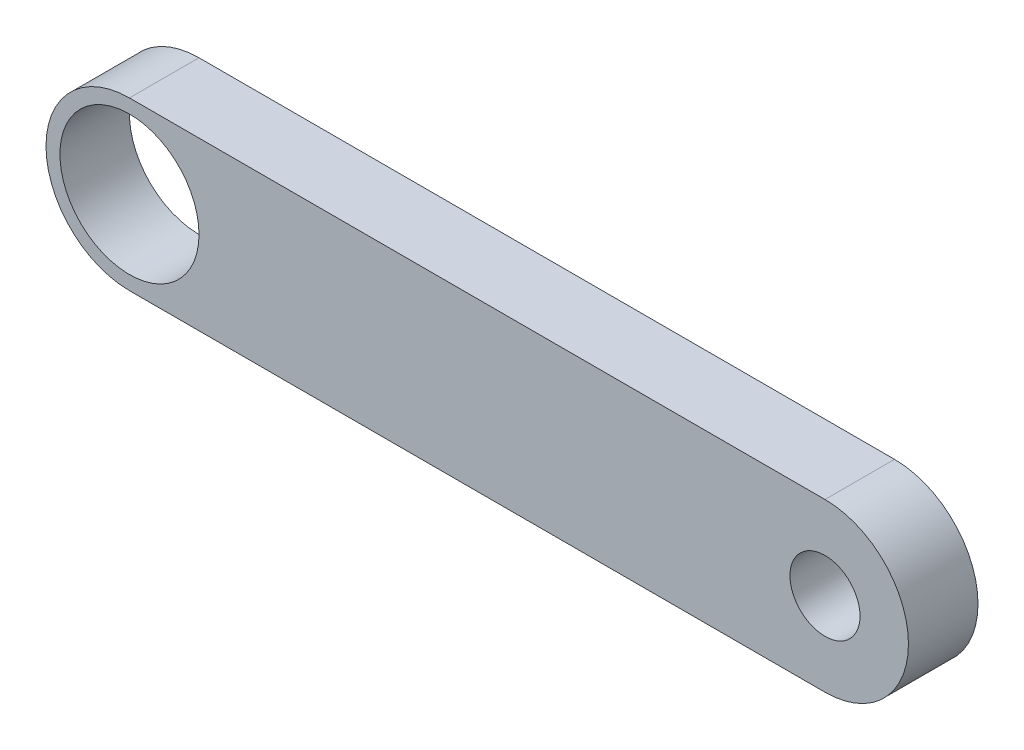
ISO-10303-21;
HEADER;
FILE_DESCRIPTION(('STEP AP214'),'2;1');
FILE_NAME('part.step','',(''),(''),'','','');
FILE_SCHEMA(('AUTOMOTIVE_DESIGN { 1 0 10303 214 1 1 1 1 }'));
ENDSEC;
DATA;
#1=APPLICATION_CONTEXT('core data for automotive mechanical design processes');
#2=APPLICATION_PROTOCOL_DEFINITION('international standard','automotive_design',2000,#1);
#3=PRODUCT_CONTEXT('',#1,'mechanical');
#4=PRODUCT('Part','Part','',(#3));
#5=PRODUCT_RELATED_PRODUCT_CATEGORY('part','',(#4));
#6=PRODUCT_DEFINITION_FORMATION('','',#4);
#7=PRODUCT_DEFINITION_CONTEXT('part definition',#1,'design');
#8=PRODUCT_DEFINITION('design','',#6,#7);
#9=PRODUCT_DEFINITION_SHAPE('','',#8);
#10=(LENGTH_UNIT() NAMED_UNIT(*) SI_UNIT(.MILLI.,.METRE.));
#11=(NAMED_UNIT(*) PLANE_ANGLE_UNIT() SI_UNIT($,.RADIAN.));
#12=(NAMED_UNIT(*) SI_UNIT($,.STERADIAN.) SOLID_ANGLE_UNIT());
#13=UNCERTAINTY_MEASURE_WITH_UNIT(LENGTH_MEASURE(1.E-05),#10,'distance_accuracy_value','');
#14=(GEOMETRIC_REPRESENTATION_CONTEXT(3) GLOBAL_UNCERTAINTY_ASSIGNED_CONTEXT((#13)) GLOBAL_UNIT_ASSIGNED_CONTEXT((#10,
#11,#12)) REPRESENTATION_CONTEXT('',''));
#15=CARTESIAN_POINT('',(0.,0.,0.));
#16=DIRECTION('',(0.,0.,1.));
#17=DIRECTION('',(1.,0.,0.));
#18=AXIS2_PLACEMENT_3D('',#15,#16,#17);
#19=CARTESIAN_POINT('',(0.,0.,5.));
#20=DIRECTION('',(0.,0.,1.));
#21=DIRECTION('',(1.,0.,0.));
#22=AXIS2_PLACEMENT_3D('',#19,#20,#21);
#23=PLANE('',#22);
#24=CARTESIAN_POINT('',(0.,0.,5.));
#25=DIRECTION('',(0.,0.,1.));
#26=DIRECTION('',(1.,0.,0.));
#27=AXIS2_PLACEMENT_3D('',#24,#25,#26);
#28=CIRCLE('',#27,5.);
#29=CARTESIAN_POINT('',(5.,0.,5.));
#30=VERTEX_POINT('',#29);
#31=EDGE_CURVE('E126',#30,#30,#28,.T.);
#32=ORIENTED_EDGE('',*,*,#31,.F.);
#33=EDGE_LOOP('',(#32));
#34=FACE_BOUND('',#33,.T.);
#35=CARTESIAN_POINT('',(0.,0.,5.));
#36=DIRECTION('',(0.,0.,1.));
#37=DIRECTION('',(1.,0.,0.));
#38=AXIS2_PLACEMENT_3D('',#35,#36,#37);
#39=CIRCLE('',#38,6.);
#40=CARTESIAN_POINT('',(0.,6.,5.));
#41=VERTEX_POINT('',#40);
#42=CARTESIAN_POINT('',(0.,-6.,5.));
#43=VERTEX_POINT('',#42);
#44=EDGE_CURVE('E93',#41,#43,#39,.T.);
#45=ORIENTED_EDGE('',*,*,#44,.T.);
#46=DIRECTION('',(1.,0.,0.));
#47=VECTOR('',#46,1.);
#48=CARTESIAN_POINT('',(0.,-6.,5.));
#49=LINE('',#48,#47);
#50=CARTESIAN_POINT('',(50.,-6.,5.));
#51=VERTEX_POINT('',#50);
#52=EDGE_CURVE('E88',#43,#51,#49,.T.);
#53=ORIENTED_EDGE('',*,*,#52,.T.);
#54=CARTESIAN_POINT('',(50.,0.,5.));
#55=DIRECTION('',(0.,0.,1.));
#56=DIRECTION('',(1.,0.,0.));
#57=AXIS2_PLACEMENT_3D('',#54,#55,#56);
#58=CIRCLE('',#57,6.);
#59=CARTESIAN_POINT('',(50.,6.,5.));
#60=VERTEX_POINT('',#59);
#61=EDGE_CURVE('E91',#51,#60,#58,.T.);
#62=ORIENTED_EDGE('',*,*,#61,.T.);
#63=DIRECTION('',(-1.,0.,0.));
#64=VECTOR('',#63,1.);
#65=CARTESIAN_POINT('',(0.,6.,5.));
#66=LINE('',#65,#64);
#67=EDGE_CURVE('E58',#60,#41,#66,.T.);
#68=ORIENTED_EDGE('',*,*,#67,.T.);
#69=EDGE_LOOP('',(#45,#53,#62,#68));
#70=FACE_BOUND('',#69,.T.);
#71=CARTESIAN_POINT('',(50.,0.,5.));
#72=DIRECTION('',(0.,0.,1.));
#73=DIRECTION('',(1.,0.,0.));
#74=AXIS2_PLACEMENT_3D('',#71,#72,#73);
#75=CIRCLE('',#74,2.51895135432881);
#76=CARTESIAN_POINT('',(52.5189513543288,0.,5.));
#77=VERTEX_POINT('',#76);
#78=EDGE_CURVE('E108',#77,#77,#75,.T.);
#79=ORIENTED_EDGE('',*,*,#78,.F.);
#80=EDGE_LOOP('',(#79));
#81=FACE_BOUND('',#80,.T.);
#82=ADVANCED_FACE('F41',(#34,#70,#81),#23,.T.);
#83=CARTESIAN_POINT('',(0.,0.,0.));
#84=DIRECTION('',(0.,0.,1.));
#85=DIRECTION('',(1.,0.,0.));
#86=AXIS2_PLACEMENT_3D('',#83,#84,#85);
#87=PLANE('',#86);
#88=CARTESIAN_POINT('',(0.,0.,0.));
#89=DIRECTION('',(0.,0.,1.));
#90=DIRECTION('',(1.,0.,0.));
#91=AXIS2_PLACEMENT_3D('',#88,#89,#90);
#92=CIRCLE('',#91,5.);
#93=CARTESIAN_POINT('',(5.,0.,0.));
#94=VERTEX_POINT('',#93);
#95=EDGE_CURVE('E123',#94,#94,#92,.T.);
#96=ORIENTED_EDGE('',*,*,#95,.T.);
#97=EDGE_LOOP('',(#96));
#98=FACE_BOUND('',#97,.T.);
#99=CARTESIAN_POINT('',(0.,0.,0.));
#100=DIRECTION('',(0.,0.,1.));
#101=DIRECTION('',(1.,0.,0.));
#102=AXIS2_PLACEMENT_3D('',#99,#100,#101);
#103=CIRCLE('',#102,6.);
#104=CARTESIAN_POINT('',(0.,6.,0.));
#105=VERTEX_POINT('',#104);
#106=CARTESIAN_POINT('',(0.,-6.,0.));
#107=VERTEX_POINT('',#106);
#108=EDGE_CURVE('E105',#105,#107,#103,.T.);
#109=ORIENTED_EDGE('',*,*,#108,.F.);
#110=DIRECTION('',(-1.,0.,0.));
#111=VECTOR('',#110,1.);
#112=CARTESIAN_POINT('',(0.,6.,0.));
#113=LINE('',#112,#111);
#114=CARTESIAN_POINT('',(50.,6.,0.));
#115=VERTEX_POINT('',#114);
#116=EDGE_CURVE('E81',#115,#105,#113,.T.);
#117=ORIENTED_EDGE('',*,*,#116,.F.);
#118=CARTESIAN_POINT('',(50.,0.,0.));
#119=DIRECTION('',(0.,0.,1.));
#120=DIRECTION('',(1.,0.,0.));
#121=AXIS2_PLACEMENT_3D('',#118,#119,#120);
#122=CIRCLE('',#121,6.);
#123=CARTESIAN_POINT('',(50.,-6.,0.));
#124=VERTEX_POINT('',#123);
#125=EDGE_CURVE('E75',#124,#115,#122,.T.);
#126=ORIENTED_EDGE('',*,*,#125,.F.);
#127=DIRECTION('',(1.,0.,0.));
#128=VECTOR('',#127,1.);
#129=CARTESIAN_POINT('',(0.,-6.,0.));
#130=LINE('',#129,#128);
#131=EDGE_CURVE('E97',#107,#124,#130,.T.);
#132=ORIENTED_EDGE('',*,*,#131,.F.);
#133=EDGE_LOOP('',(#109,#117,#126,#132));
#134=FACE_BOUND('',#133,.T.);
#135=CARTESIAN_POINT('',(50.,0.,0.));
#136=DIRECTION('',(0.,0.,1.));
#137=DIRECTION('',(1.,0.,0.));
#138=AXIS2_PLACEMENT_3D('',#135,#136,#137);
#139=CIRCLE('',#138,2.51895135432881);
#140=CARTESIAN_POINT('',(52.5189513543288,0.,0.));
#141=VERTEX_POINT('',#140);
#142=EDGE_CURVE('E120',#141,#141,#139,.T.);
#143=ORIENTED_EDGE('',*,*,#142,.T.);
#144=EDGE_LOOP('',(#143));
#145=FACE_BOUND('',#144,.T.);
#146=ADVANCED_FACE('F116',(#98,#134,#145),#87,.F.);
#147=CARTESIAN_POINT('',(0.,0.,5.));
#148=DIRECTION('',(0.,0.,-1.));
#149=DIRECTION('',(-1.,0.,0.));
#150=AXIS2_PLACEMENT_3D('',#147,#148,#149);
#151=CYLINDRICAL_SURFACE('',#150,6.);
#152=ORIENTED_EDGE('',*,*,#108,.T.);
#153=DIRECTION('',(0.,0.,-1.));
#154=VECTOR('',#153,1.);
#155=CARTESIAN_POINT('',(0.,-6.,5.));
#156=LINE('',#155,#154);
#157=EDGE_CURVE('E11',#43,#107,#156,.T.);
#158=ORIENTED_EDGE('',*,*,#157,.F.);
#159=ORIENTED_EDGE('',*,*,#44,.F.);
#160=DIRECTION('',(0.,0.,-1.));
#161=VECTOR('',#160,1.);
#162=CARTESIAN_POINT('',(0.,6.,5.));
#163=LINE('',#162,#161);
#164=EDGE_CURVE('E101',#41,#105,#163,.T.);
#165=ORIENTED_EDGE('',*,*,#164,.T.);
#166=EDGE_LOOP('',(#152,#158,#159,#165));
#167=FACE_BOUND('',#166,.T.);
#168=ADVANCED_FACE('F43',(#167),#151,.T.);
#169=CARTESIAN_POINT('',(0.,-6.,5.));
#170=DIRECTION('',(0.,1.,0.));
#171=DIRECTION('',(0.,0.,1.));
#172=AXIS2_PLACEMENT_3D('',#169,#170,#171);
#173=PLANE('',#172);
#174=ORIENTED_EDGE('',*,*,#131,.T.);
#175=DIRECTION('',(0.,0.,-1.));
#176=VECTOR('',#175,1.);
#177=CARTESIAN_POINT('',(50.,-6.,5.));
#178=LINE('',#177,#176);
#179=EDGE_CURVE('E50',#51,#124,#178,.T.);
#180=ORIENTED_EDGE('',*,*,#179,.F.);
#181=ORIENTED_EDGE('',*,*,#52,.F.);
#182=ORIENTED_EDGE('',*,*,#157,.T.);
#183=EDGE_LOOP('',(#174,#180,#181,#182));
#184=FACE_BOUND('',#183,.T.);
#185=ADVANCED_FACE('F96',(#184),#173,.F.);
#186=CARTESIAN_POINT('',(50.,0.,5.));
#187=DIRECTION('',(0.,0.,-1.));
#188=DIRECTION('',(-1.,0.,0.));
#189=AXIS2_PLACEMENT_3D('',#186,#187,#188);
#190=CYLINDRICAL_SURFACE('',#189,6.);
#191=ORIENTED_EDGE('',*,*,#125,.T.);
#192=DIRECTION('',(0.,0.,-1.));
#193=VECTOR('',#192,1.);
#194=CARTESIAN_POINT('',(50.,6.,5.));
#195=LINE('',#194,#193);
#196=EDGE_CURVE('E98',#60,#115,#195,.T.);
#197=ORIENTED_EDGE('',*,*,#196,.F.);
#198=ORIENTED_EDGE('',*,*,#61,.F.);
#199=ORIENTED_EDGE('',*,*,#179,.T.);
#200=EDGE_LOOP('',(#191,#197,#198,#199));
#201=FACE_BOUND('',#200,.T.);
#202=ADVANCED_FACE('F99',(#201),#190,.T.);
#203=CARTESIAN_POINT('',(0.,6.,5.));
#204=DIRECTION('',(0.,-1.,0.));
#205=DIRECTION('',(0.,0.,-1.));
#206=AXIS2_PLACEMENT_3D('',#203,#204,#205);
#207=PLANE('',#206);
#208=ORIENTED_EDGE('',*,*,#116,.T.);
#209=ORIENTED_EDGE('',*,*,#164,.F.);
#210=ORIENTED_EDGE('',*,*,#67,.F.);
#211=ORIENTED_EDGE('',*,*,#196,.T.);
#212=EDGE_LOOP('',(#208,#209,#210,#211));
#213=FACE_BOUND('',#212,.T.);
#214=ADVANCED_FACE('F113',(#213),#207,.F.);
#215=CARTESIAN_POINT('',(50.,0.,5.));
#216=DIRECTION('',(0.,0.,-1.));
#217=DIRECTION('',(-1.,0.,0.));
#218=AXIS2_PLACEMENT_3D('',#215,#216,#217);
#219=CYLINDRICAL_SURFACE('',#218,2.51895135432881);
#220=ORIENTED_EDGE('',*,*,#78,.T.);
#221=EDGE_LOOP('',(#220));
#222=FACE_BOUND('',#221,.T.);
#223=ORIENTED_EDGE('',*,*,#142,.F.);
#224=EDGE_LOOP('',(#223));
#225=FACE_BOUND('',#224,.T.);
#226=ADVANCED_FACE('F136',(#222,#225),#219,.F.);
#227=CARTESIAN_POINT('',(0.,0.,0.));
#228=DIRECTION('',(0.,0.,1.));
#229=DIRECTION('',(1.,0.,0.));
#230=AXIS2_PLACEMENT_3D('',#227,#228,#229);
#231=CYLINDRICAL_SURFACE('',#230,5.);
#232=ORIENTED_EDGE('',*,*,#95,.F.);
#233=EDGE_LOOP('',(#232));
#234=FACE_BOUND('',#233,.T.);
#235=ORIENTED_EDGE('',*,*,#31,.T.);
#236=EDGE_LOOP('',(#235));
#237=FACE_BOUND('',#236,.T.);
#238=ADVANCED_FACE('F133',(#234,#237),#231,.F.);
#239=CLOSED_SHELL('',(#82,#146,#168,#185,#202,#214,#226,#238));
#240=MANIFOLD_SOLID_BREP('B2',#239);
#241=ADVANCED_BREP_SHAPE_REPRESENTATION('',(#18,#240),#14);
#242=SHAPE_DEFINITION_REPRESENTATION(#9,#241);
ENDSEC;
END-ISO-10303-21;
